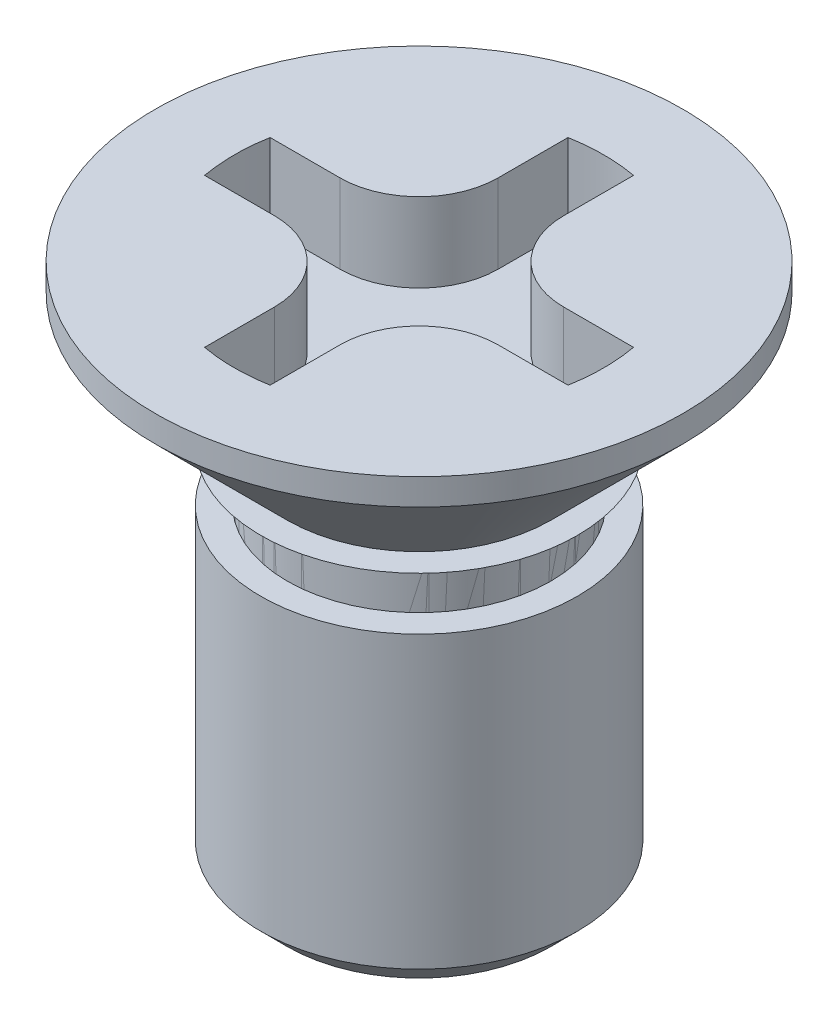
ISO-10303-21;
HEADER;
FILE_DESCRIPTION(('STEP AP214'),'2;1');
FILE_NAME('part.step','',(''),(''),'','','');
FILE_SCHEMA(('AUTOMOTIVE_DESIGN { 1 0 10303 214 1 1 1 1 }'));
ENDSEC;
DATA;
#1=APPLICATION_CONTEXT('core data for automotive mechanical design processes');
#2=APPLICATION_PROTOCOL_DEFINITION('international standard','automotive_design',2000,#1);
#3=PRODUCT_CONTEXT('',#1,'mechanical');
#4=PRODUCT('Part','Part','',(#3));
#5=PRODUCT_RELATED_PRODUCT_CATEGORY('part','',(#4));
#6=PRODUCT_DEFINITION_FORMATION('','',#4);
#7=PRODUCT_DEFINITION_CONTEXT('part definition',#1,'design');
#8=PRODUCT_DEFINITION('design','',#6,#7);
#9=PRODUCT_DEFINITION_SHAPE('','',#8);
#10=(LENGTH_UNIT() NAMED_UNIT(*) SI_UNIT(.MILLI.,.METRE.));
#11=(NAMED_UNIT(*) PLANE_ANGLE_UNIT() SI_UNIT($,.RADIAN.));
#12=(NAMED_UNIT(*) SI_UNIT($,.STERADIAN.) SOLID_ANGLE_UNIT());
#13=UNCERTAINTY_MEASURE_WITH_UNIT(LENGTH_MEASURE(1.E-05),#10,'distance_accuracy_value','');
#14=(GEOMETRIC_REPRESENTATION_CONTEXT(3) GLOBAL_UNCERTAINTY_ASSIGNED_CONTEXT((#13)) GLOBAL_UNIT_ASSIGNED_CONTEXT((#10,
#11,#12)) REPRESENTATION_CONTEXT('',''));
#15=CARTESIAN_POINT('',(0.,0.,0.));
#16=DIRECTION('',(0.,0.,1.));
#17=DIRECTION('',(1.,0.,0.));
#18=AXIS2_PLACEMENT_3D('',#15,#16,#17);
#19=CARTESIAN_POINT('',(0.,0.75,0.));
#20=DIRECTION('',(0.,-1.,0.));
#21=DIRECTION('',(0.,0.,-1.));
#22=AXIS2_PLACEMENT_3D('',#19,#20,#21);
#23=PLANE('',#22);
#24=CARTESIAN_POINT('',(-1.06066017178,0.75,1.06066017178));
#25=DIRECTION('',(0.,1.,0.));
#26=DIRECTION('',(1.,0.,0.));
#27=AXIS2_PLACEMENT_3D('',#24,#25,#26);
#28=CIRCLE('',#27,0.75);
#29=CARTESIAN_POINT('',(-0.3106601717798,0.75,1.06066017178));
#30=VERTEX_POINT('',#29);
#31=CARTESIAN_POINT('',(-1.06066017178,0.75,0.3106601717798));
#32=VERTEX_POINT('',#31);
#33=EDGE_CURVE('P0_E11',#30,#32,#28,.T.);
#34=ORIENTED_EDGE('',*,*,#33,.F.);
#35=DIRECTION('',(0.,0.,-1.));
#36=VECTOR('',#35,1.);
#37=CARTESIAN_POINT('',(-0.3106601717798,0.75,1.722205056801));
#38=LINE('',#37,#36);
#39=CARTESIAN_POINT('',(-0.3106601717798,0.75,1.722205056801));
#40=VERTEX_POINT('',#39);
#41=EDGE_CURVE('P0_E45',#40,#30,#38,.T.);
#42=ORIENTED_EDGE('',*,*,#41,.F.);
#43=CARTESIAN_POINT('',(0.,0.75,0.));
#44=DIRECTION('',(0.,-1.,0.));
#45=DIRECTION('',(0.177520098159893,0.,0.984117175314658));
#46=AXIS2_PLACEMENT_3D('',#43,#44,#45);
#47=CIRCLE('',#46,1.75);
#48=CARTESIAN_POINT('',(0.3106601717798,0.75,1.722205056801));
#49=VERTEX_POINT('',#48);
#50=EDGE_CURVE('P0_E184',#49,#40,#47,.T.);
#51=ORIENTED_EDGE('',*,*,#50,.F.);
#52=DIRECTION('',(0.,0.,1.));
#53=VECTOR('',#52,1.);
#54=CARTESIAN_POINT('',(0.3106601717798,0.75,1.06066017178));
#55=LINE('',#54,#53);
#56=CARTESIAN_POINT('',(0.3106601717798,0.75,1.06066017178));
#57=VERTEX_POINT('',#56);
#58=EDGE_CURVE('P0_E107',#57,#49,#55,.T.);
#59=ORIENTED_EDGE('',*,*,#58,.F.);
#60=CARTESIAN_POINT('',(1.06066017178,0.75,1.06066017178));
#61=DIRECTION('',(0.,1.,0.));
#62=DIRECTION('',(0.,0.,-1.));
#63=AXIS2_PLACEMENT_3D('',#60,#61,#62);
#64=CIRCLE('',#63,0.75);
#65=CARTESIAN_POINT('',(1.06066017178,0.75,0.3106601717798));
#66=VERTEX_POINT('',#65);
#67=EDGE_CURVE('P0_E99',#66,#57,#64,.T.);
#68=ORIENTED_EDGE('',*,*,#67,.F.);
#69=DIRECTION('',(-1.,0.,0.));
#70=VECTOR('',#69,1.);
#71=CARTESIAN_POINT('',(1.722205056801,0.75,0.3106601717798));
#72=LINE('',#71,#70);
#73=CARTESIAN_POINT('',(1.722205056801,0.75,0.3106601717798));
#74=VERTEX_POINT('',#73);
#75=EDGE_CURVE('P0_E238',#74,#66,#72,.T.);
#76=ORIENTED_EDGE('',*,*,#75,.F.);
#77=CARTESIAN_POINT('',(0.,0.75,0.));
#78=DIRECTION('',(0.,-1.,0.));
#79=DIRECTION('',(0.984117175314658,0.,-0.177520098159893));
#80=AXIS2_PLACEMENT_3D('',#77,#78,#79);
#81=CIRCLE('',#80,1.75);
#82=CARTESIAN_POINT('',(1.722205056801,0.75,-0.3106601717798));
#83=VERTEX_POINT('',#82);
#84=EDGE_CURVE('P0_E239',#83,#74,#81,.T.);
#85=ORIENTED_EDGE('',*,*,#84,.F.);
#86=DIRECTION('',(1.,0.,0.));
#87=VECTOR('',#86,1.);
#88=CARTESIAN_POINT('',(1.06066017178,0.75,-0.3106601717798));
#89=LINE('',#88,#87);
#90=CARTESIAN_POINT('',(1.06066017178,0.75,-0.3106601717798));
#91=VERTEX_POINT('',#90);
#92=EDGE_CURVE('P0_E243',#91,#83,#89,.T.);
#93=ORIENTED_EDGE('',*,*,#92,.F.);
#94=CARTESIAN_POINT('',(1.06066017178,0.75,-1.06066017178));
#95=DIRECTION('',(0.,1.,0.));
#96=DIRECTION('',(-1.,0.,0.));
#97=AXIS2_PLACEMENT_3D('',#94,#95,#96);
#98=CIRCLE('',#97,0.75);
#99=CARTESIAN_POINT('',(0.3106601717798,0.75,-1.06066017178));
#100=VERTEX_POINT('',#99);
#101=EDGE_CURVE('P0_E244',#100,#91,#98,.T.);
#102=ORIENTED_EDGE('',*,*,#101,.F.);
#103=DIRECTION('',(0.,0.,1.));
#104=VECTOR('',#103,1.);
#105=CARTESIAN_POINT('',(0.3106601717798,0.75,-1.722205056801));
#106=LINE('',#105,#104);
#107=CARTESIAN_POINT('',(0.3106601717798,0.75,-1.722205056801));
#108=VERTEX_POINT('',#107);
#109=EDGE_CURVE('P0_E255',#108,#100,#106,.T.);
#110=ORIENTED_EDGE('',*,*,#109,.F.);
#111=CARTESIAN_POINT('',(0.,0.75,0.));
#112=DIRECTION('',(0.,-1.,0.));
#113=DIRECTION('',(-0.177520098159893,0.,-0.984117175314658));
#114=AXIS2_PLACEMENT_3D('',#111,#112,#113);
#115=CIRCLE('',#114,1.75);
#116=CARTESIAN_POINT('',(-0.3106601717798,0.75,-1.722205056801));
#117=VERTEX_POINT('',#116);
#118=EDGE_CURVE('P0_E256',#117,#108,#115,.T.);
#119=ORIENTED_EDGE('',*,*,#118,.F.);
#120=DIRECTION('',(0.,0.,-1.));
#121=VECTOR('',#120,1.);
#122=CARTESIAN_POINT('',(-0.3106601717798,0.75,-1.06066017178));
#123=LINE('',#122,#121);
#124=CARTESIAN_POINT('',(-0.3106601717798,0.75,-1.06066017178));
#125=VERTEX_POINT('',#124);
#126=EDGE_CURVE('P0_E251',#125,#117,#123,.T.);
#127=ORIENTED_EDGE('',*,*,#126,.F.);
#128=CARTESIAN_POINT('',(-1.06066017178,0.75,-1.06066017178));
#129=DIRECTION('',(0.,1.,0.));
#130=DIRECTION('',(0.,0.,1.));
#131=AXIS2_PLACEMENT_3D('',#128,#129,#130);
#132=CIRCLE('',#131,0.75);
#133=CARTESIAN_POINT('',(-1.06066017178,0.75,-0.3106601717798));
#134=VERTEX_POINT('',#133);
#135=EDGE_CURVE('P0_E234',#134,#125,#132,.T.);
#136=ORIENTED_EDGE('',*,*,#135,.F.);
#137=DIRECTION('',(1.,0.,0.));
#138=VECTOR('',#137,1.);
#139=CARTESIAN_POINT('',(-1.722205056801,0.75,-0.3106601717798));
#140=LINE('',#139,#138);
#141=CARTESIAN_POINT('',(-1.722205056801,0.75,-0.3106601717798));
#142=VERTEX_POINT('',#141);
#143=EDGE_CURVE('P0_E227',#142,#134,#140,.T.);
#144=ORIENTED_EDGE('',*,*,#143,.F.);
#145=CARTESIAN_POINT('',(0.,0.75,0.));
#146=DIRECTION('',(0.,-1.,0.));
#147=DIRECTION('',(-0.984117175314658,0.,0.177520098159893));
#148=AXIS2_PLACEMENT_3D('',#145,#146,#147);
#149=CIRCLE('',#148,1.75);
#150=CARTESIAN_POINT('',(-1.722205056801,0.75,0.3106601717798));
#151=VERTEX_POINT('',#150);
#152=EDGE_CURVE('P0_E219',#151,#142,#149,.T.);
#153=ORIENTED_EDGE('',*,*,#152,.F.);
#154=DIRECTION('',(-1.,0.,0.));
#155=VECTOR('',#154,1.);
#156=CARTESIAN_POINT('',(-1.06066017178,0.75,0.3106601717798));
#157=LINE('',#156,#155);
#158=EDGE_CURVE('P0_E218',#32,#151,#157,.T.);
#159=ORIENTED_EDGE('',*,*,#158,.F.);
#160=EDGE_LOOP('',(#34,#42,#51,#59,#68,#76,#85,#93,#102,#110,#119,#127,#136,#144,#153,#159));
#161=FACE_BOUND('',#160,.T.);
#162=ADVANCED_FACE('P0_F17',(#161),#23,.F.);
#163=CARTESIAN_POINT('',(-1.06066017178,0.75,1.06066017178));
#164=DIRECTION('',(0.,-1.,0.));
#165=DIRECTION('',(1.,0.,0.));
#166=AXIS2_PLACEMENT_3D('',#163,#164,#165);
#167=CYLINDRICAL_SURFACE('',#166,0.75);
#168=DIRECTION('',(0.,1.,0.));
#169=VECTOR('',#168,1.);
#170=CARTESIAN_POINT('',(-0.3106601717798,0.75,1.06066017178));
#171=LINE('',#170,#169);
#172=CARTESIAN_POINT('',(-0.3106601717798,1.5,1.06066017178));
#173=VERTEX_POINT('',#172);
#174=EDGE_CURVE('P0_E25',#30,#173,#171,.T.);
#175=ORIENTED_EDGE('',*,*,#174,.F.);
#176=ORIENTED_EDGE('',*,*,#33,.T.);
#177=DIRECTION('',(0.,1.,0.));
#178=VECTOR('',#177,1.);
#179=CARTESIAN_POINT('',(-1.06066017178,0.75,0.3106601717798));
#180=LINE('',#179,#178);
#181=CARTESIAN_POINT('',(-1.06066017178,1.5,0.3106601717798));
#182=VERTEX_POINT('',#181);
#183=EDGE_CURVE('P0_E215',#32,#182,#180,.T.);
#184=ORIENTED_EDGE('',*,*,#183,.T.);
#185=CARTESIAN_POINT('',(-1.06066017178,1.5,1.06066017178));
#186=DIRECTION('',(0.,1.,0.));
#187=DIRECTION('',(1.,0.,0.));
#188=AXIS2_PLACEMENT_3D('',#185,#186,#187);
#189=CIRCLE('',#188,0.75);
#190=EDGE_CURVE('P0_E195',#173,#182,#189,.T.);
#191=ORIENTED_EDGE('',*,*,#190,.F.);
#192=EDGE_LOOP('',(#175,#176,#184,#191));
#193=FACE_BOUND('',#192,.T.);
#194=ADVANCED_FACE('P0_F396',(#193),#167,.T.);
#195=CARTESIAN_POINT('',(-0.3106601717798,0.75,1.722205056801));
#196=DIRECTION('',(-1.,0.,0.));
#197=DIRECTION('',(0.,0.,1.));
#198=AXIS2_PLACEMENT_3D('',#195,#196,#197);
#199=PLANE('',#198);
#200=DIRECTION('',(0.,1.,0.));
#201=VECTOR('',#200,1.);
#202=CARTESIAN_POINT('',(-0.3106601717798,0.75,1.722205056801));
#203=LINE('',#202,#201);
#204=CARTESIAN_POINT('',(-0.3106601717798,1.5,1.722205056801));
#205=VERTEX_POINT('',#204);
#206=EDGE_CURVE('P0_E178',#40,#205,#203,.T.);
#207=ORIENTED_EDGE('',*,*,#206,.F.);
#208=ORIENTED_EDGE('',*,*,#41,.T.);
#209=ORIENTED_EDGE('',*,*,#174,.T.);
#210=DIRECTION('',(0.,0.,-1.));
#211=VECTOR('',#210,1.);
#212=CARTESIAN_POINT('',(-0.3106601717798,1.5,1.722205056801));
#213=LINE('',#212,#211);
#214=EDGE_CURVE('P0_E189',#205,#173,#213,.T.);
#215=ORIENTED_EDGE('',*,*,#214,.F.);
#216=EDGE_LOOP('',(#207,#208,#209,#215));
#217=FACE_BOUND('',#216,.T.);
#218=ADVANCED_FACE('P0_F190',(#217),#199,.F.);
#219=CARTESIAN_POINT('',(0.,0.75,0.));
#220=DIRECTION('',(0.,-1.,0.));
#221=DIRECTION('',(1.,0.,0.));
#222=AXIS2_PLACEMENT_3D('',#219,#220,#221);
#223=CYLINDRICAL_SURFACE('',#222,1.75);
#224=DIRECTION('',(0.,1.,0.));
#225=VECTOR('',#224,1.);
#226=CARTESIAN_POINT('',(0.3106601717798,0.75,1.722205056801));
#227=LINE('',#226,#225);
#228=CARTESIAN_POINT('',(0.3106601717798,1.5,1.722205056801));
#229=VERTEX_POINT('',#228);
#230=EDGE_CURVE('P0_E172',#49,#229,#227,.T.);
#231=ORIENTED_EDGE('',*,*,#230,.F.);
#232=ORIENTED_EDGE('',*,*,#50,.T.);
#233=ORIENTED_EDGE('',*,*,#206,.T.);
#234=CARTESIAN_POINT('',(0.,1.5,0.));
#235=DIRECTION('',(0.,-1.,0.));
#236=DIRECTION('',(0.177520098159893,0.,0.984117175314658));
#237=AXIS2_PLACEMENT_3D('',#234,#235,#236);
#238=CIRCLE('',#237,1.75);
#239=EDGE_CURVE('P0_E182',#229,#205,#238,.T.);
#240=ORIENTED_EDGE('',*,*,#239,.F.);
#241=EDGE_LOOP('',(#231,#232,#233,#240));
#242=FACE_BOUND('',#241,.T.);
#243=ADVANCED_FACE('P0_F180',(#242),#223,.F.);
#244=CARTESIAN_POINT('',(0.3106601717798,0.75,1.06066017178));
#245=DIRECTION('',(1.,0.,0.));
#246=DIRECTION('',(0.,1.,0.));
#247=AXIS2_PLACEMENT_3D('',#244,#245,#246);
#248=PLANE('',#247);
#249=DIRECTION('',(0.,1.,0.));
#250=VECTOR('',#249,1.);
#251=CARTESIAN_POINT('',(0.3106601717798,0.75,1.06066017178));
#252=LINE('',#251,#250);
#253=CARTESIAN_POINT('',(0.3106601717798,1.5,1.06066017178));
#254=VERTEX_POINT('',#253);
#255=EDGE_CURVE('P0_E274',#57,#254,#252,.T.);
#256=ORIENTED_EDGE('',*,*,#255,.F.);
#257=ORIENTED_EDGE('',*,*,#58,.T.);
#258=ORIENTED_EDGE('',*,*,#230,.T.);
#259=DIRECTION('',(0.,0.,1.));
#260=VECTOR('',#259,1.);
#261=CARTESIAN_POINT('',(0.3106601717798,1.5,1.06066017178));
#262=LINE('',#261,#260);
#263=EDGE_CURVE('P0_E201',#254,#229,#262,.T.);
#264=ORIENTED_EDGE('',*,*,#263,.F.);
#265=EDGE_LOOP('',(#256,#257,#258,#264));
#266=FACE_BOUND('',#265,.T.);
#267=ADVANCED_FACE('P0_F384',(#266),#248,.F.);
#268=CARTESIAN_POINT('',(1.06066017178,0.75,1.06066017178));
#269=DIRECTION('',(0.,-1.,0.));
#270=DIRECTION('',(1.,0.,0.));
#271=AXIS2_PLACEMENT_3D('',#268,#269,#270);
#272=CYLINDRICAL_SURFACE('',#271,0.75);
#273=DIRECTION('',(0.,1.,0.));
#274=VECTOR('',#273,1.);
#275=CARTESIAN_POINT('',(1.06066017178,0.75,0.3106601717798));
#276=LINE('',#275,#274);
#277=CARTESIAN_POINT('',(1.06066017178,1.5,0.3106601717798));
#278=VERTEX_POINT('',#277);
#279=EDGE_CURVE('P0_E269',#66,#278,#276,.T.);
#280=ORIENTED_EDGE('',*,*,#279,.F.);
#281=ORIENTED_EDGE('',*,*,#67,.T.);
#282=ORIENTED_EDGE('',*,*,#255,.T.);
#283=CARTESIAN_POINT('',(1.06066017178,1.5,1.06066017178));
#284=DIRECTION('',(0.,1.,0.));
#285=DIRECTION('',(0.,0.,-1.));
#286=AXIS2_PLACEMENT_3D('',#283,#284,#285);
#287=CIRCLE('',#286,0.75);
#288=EDGE_CURVE('P0_E207',#278,#254,#287,.T.);
#289=ORIENTED_EDGE('',*,*,#288,.F.);
#290=EDGE_LOOP('',(#280,#281,#282,#289));
#291=FACE_BOUND('',#290,.T.);
#292=ADVANCED_FACE('P0_F383',(#291),#272,.T.);
#293=CARTESIAN_POINT('',(1.722205056801,0.75,0.3106601717798));
#294=DIRECTION('',(0.,0.,1.));
#295=DIRECTION('',(1.,0.,0.));
#296=AXIS2_PLACEMENT_3D('',#293,#294,#295);
#297=PLANE('',#296);
#298=DIRECTION('',(0.,1.,0.));
#299=VECTOR('',#298,1.);
#300=CARTESIAN_POINT('',(1.722205056801,0.75,0.3106601717798));
#301=LINE('',#300,#299);
#302=CARTESIAN_POINT('',(1.722205056801,1.5,0.3106601717798));
#303=VERTEX_POINT('',#302);
#304=EDGE_CURVE('P0_E235',#74,#303,#301,.T.);
#305=ORIENTED_EDGE('',*,*,#304,.F.);
#306=ORIENTED_EDGE('',*,*,#75,.T.);
#307=ORIENTED_EDGE('',*,*,#279,.T.);
#308=DIRECTION('',(-1.,0.,0.));
#309=VECTOR('',#308,1.);
#310=CARTESIAN_POINT('',(1.722205056801,1.5,0.3106601717798));
#311=LINE('',#310,#309);
#312=EDGE_CURVE('P0_E335',#303,#278,#311,.T.);
#313=ORIENTED_EDGE('',*,*,#312,.F.);
#314=EDGE_LOOP('',(#305,#306,#307,#313));
#315=FACE_BOUND('',#314,.T.);
#316=ADVANCED_FACE('P0_F392',(#315),#297,.F.);
#317=CARTESIAN_POINT('',(0.,0.75,0.));
#318=DIRECTION('',(0.,-1.,0.));
#319=DIRECTION('',(1.,0.,0.));
#320=AXIS2_PLACEMENT_3D('',#317,#318,#319);
#321=CYLINDRICAL_SURFACE('',#320,1.75);
#322=DIRECTION('',(0.,1.,0.));
#323=VECTOR('',#322,1.);
#324=CARTESIAN_POINT('',(1.722205056801,0.75,-0.3106601717798));
#325=LINE('',#324,#323);
#326=CARTESIAN_POINT('',(1.722205056801,1.5,-0.3106601717798));
#327=VERTEX_POINT('',#326);
#328=EDGE_CURVE('P0_E263',#83,#327,#325,.T.);
#329=ORIENTED_EDGE('',*,*,#328,.F.);
#330=ORIENTED_EDGE('',*,*,#84,.T.);
#331=ORIENTED_EDGE('',*,*,#304,.T.);
#332=CARTESIAN_POINT('',(0.,1.5,0.));
#333=DIRECTION('',(0.,-1.,0.));
#334=DIRECTION('',(0.984117175314658,0.,-0.177520098159893));
#335=AXIS2_PLACEMENT_3D('',#332,#333,#334);
#336=CIRCLE('',#335,1.75);
#337=EDGE_CURVE('P0_E339',#327,#303,#336,.T.);
#338=ORIENTED_EDGE('',*,*,#337,.F.);
#339=EDGE_LOOP('',(#329,#330,#331,#338));
#340=FACE_BOUND('',#339,.T.);
#341=ADVANCED_FACE('P0_F447',(#340),#321,.F.);
#342=CARTESIAN_POINT('',(1.06066017178,0.75,-0.3106601717798));
#343=DIRECTION('',(0.,0.,-1.));
#344=DIRECTION('',(0.,-1.,0.));
#345=AXIS2_PLACEMENT_3D('',#342,#343,#344);
#346=PLANE('',#345);
#347=ORIENTED_EDGE('',*,*,#92,.T.);
#348=ORIENTED_EDGE('',*,*,#328,.T.);
#349=DIRECTION('',(1.,0.,0.));
#350=VECTOR('',#349,1.);
#351=CARTESIAN_POINT('',(1.06066017178,1.5,-0.3106601717798));
#352=LINE('',#351,#350);
#353=CARTESIAN_POINT('',(1.06066017178,1.5,-0.3106601717798));
#354=VERTEX_POINT('',#353);
#355=EDGE_CURVE('P0_E368',#354,#327,#352,.T.);
#356=ORIENTED_EDGE('',*,*,#355,.F.);
#357=DIRECTION('',(0.,1.,0.));
#358=VECTOR('',#357,1.);
#359=CARTESIAN_POINT('',(1.06066017178,0.75,-0.3106601717798));
#360=LINE('',#359,#358);
#361=EDGE_CURVE('P0_E240',#91,#354,#360,.T.);
#362=ORIENTED_EDGE('',*,*,#361,.F.);
#363=EDGE_LOOP('',(#347,#348,#356,#362));
#364=FACE_BOUND('',#363,.T.);
#365=ADVANCED_FACE('P0_F443',(#364),#346,.F.);
#366=CARTESIAN_POINT('',(1.06066017178,0.75,-1.06066017178));
#367=DIRECTION('',(0.,-1.,0.));
#368=DIRECTION('',(1.,0.,0.));
#369=AXIS2_PLACEMENT_3D('',#366,#367,#368);
#370=CYLINDRICAL_SURFACE('',#369,0.75);
#371=ORIENTED_EDGE('',*,*,#101,.T.);
#372=ORIENTED_EDGE('',*,*,#361,.T.);
#373=CARTESIAN_POINT('',(1.06066017178,1.5,-1.06066017178));
#374=DIRECTION('',(0.,-1.,0.));
#375=DIRECTION('',(0.,0.,1.));
#376=AXIS2_PLACEMENT_3D('',#373,#374,#375);
#377=CIRCLE('',#376,0.75);
#378=CARTESIAN_POINT('',(0.3106601717798,1.5,-1.06066017178));
#379=VERTEX_POINT('',#378);
#380=EDGE_CURVE('P0_E362',#354,#379,#377,.T.);
#381=ORIENTED_EDGE('',*,*,#380,.T.);
#382=DIRECTION('',(0.,1.,0.));
#383=VECTOR('',#382,1.);
#384=CARTESIAN_POINT('',(0.3106601717798,0.75,-1.06066017178));
#385=LINE('',#384,#383);
#386=EDGE_CURVE('P0_E257',#100,#379,#385,.T.);
#387=ORIENTED_EDGE('',*,*,#386,.F.);
#388=EDGE_LOOP('',(#371,#372,#381,#387));
#389=FACE_BOUND('',#388,.T.);
#390=ADVANCED_FACE('P0_F439',(#389),#370,.T.);
#391=CARTESIAN_POINT('',(0.3106601717798,0.75,-1.722205056801));
#392=DIRECTION('',(1.,0.,0.));
#393=DIRECTION('',(0.,1.,0.));
#394=AXIS2_PLACEMENT_3D('',#391,#392,#393);
#395=PLANE('',#394);
#396=ORIENTED_EDGE('',*,*,#109,.T.);
#397=ORIENTED_EDGE('',*,*,#386,.T.);
#398=DIRECTION('',(0.,0.,1.));
#399=VECTOR('',#398,1.);
#400=CARTESIAN_POINT('',(0.3106601717798,1.5,-1.722205056801));
#401=LINE('',#400,#399);
#402=CARTESIAN_POINT('',(0.3106601717798,1.5,-1.722205056801));
#403=VERTEX_POINT('',#402);
#404=EDGE_CURVE('P0_E355',#403,#379,#401,.T.);
#405=ORIENTED_EDGE('',*,*,#404,.F.);
#406=DIRECTION('',(0.,1.,0.));
#407=VECTOR('',#406,1.);
#408=CARTESIAN_POINT('',(0.3106601717798,0.75,-1.722205056801));
#409=LINE('',#408,#407);
#410=EDGE_CURVE('P0_E252',#108,#403,#409,.T.);
#411=ORIENTED_EDGE('',*,*,#410,.F.);
#412=EDGE_LOOP('',(#396,#397,#405,#411));
#413=FACE_BOUND('',#412,.T.);
#414=ADVANCED_FACE('P0_F436',(#413),#395,.F.);
#415=CARTESIAN_POINT('',(0.,0.75,0.));
#416=DIRECTION('',(0.,-1.,0.));
#417=DIRECTION('',(1.,0.,0.));
#418=AXIS2_PLACEMENT_3D('',#415,#416,#417);
#419=CYLINDRICAL_SURFACE('',#418,1.75);
#420=ORIENTED_EDGE('',*,*,#118,.T.);
#421=ORIENTED_EDGE('',*,*,#410,.T.);
#422=CARTESIAN_POINT('',(0.,1.5,0.));
#423=DIRECTION('',(0.,-1.,0.));
#424=DIRECTION('',(-0.177520098159893,0.,-0.984117175314658));
#425=AXIS2_PLACEMENT_3D('',#422,#423,#424);
#426=CIRCLE('',#425,1.75);
#427=CARTESIAN_POINT('',(-0.3106601717798,1.5,-1.722205056801));
#428=VERTEX_POINT('',#427);
#429=EDGE_CURVE('P0_E351',#428,#403,#426,.T.);
#430=ORIENTED_EDGE('',*,*,#429,.F.);
#431=DIRECTION('',(0.,1.,0.));
#432=VECTOR('',#431,1.);
#433=CARTESIAN_POINT('',(-0.3106601717798,0.75,-1.722205056801));
#434=LINE('',#433,#432);
#435=EDGE_CURVE('P0_E284',#117,#428,#434,.T.);
#436=ORIENTED_EDGE('',*,*,#435,.F.);
#437=EDGE_LOOP('',(#420,#421,#430,#436));
#438=FACE_BOUND('',#437,.T.);
#439=ADVANCED_FACE('P0_F431',(#438),#419,.F.);
#440=CARTESIAN_POINT('',(-0.3106601717798,0.75,-1.06066017178));
#441=DIRECTION('',(-1.,0.,0.));
#442=DIRECTION('',(0.,0.,1.));
#443=AXIS2_PLACEMENT_3D('',#440,#441,#442);
#444=PLANE('',#443);
#445=ORIENTED_EDGE('',*,*,#126,.T.);
#446=ORIENTED_EDGE('',*,*,#435,.T.);
#447=DIRECTION('',(0.,0.,-1.));
#448=VECTOR('',#447,1.);
#449=CARTESIAN_POINT('',(-0.3106601717798,1.5,-1.06066017178));
#450=LINE('',#449,#448);
#451=CARTESIAN_POINT('',(-0.3106601717798,1.5,-1.06066017178));
#452=VERTEX_POINT('',#451);
#453=EDGE_CURVE('P0_E347',#452,#428,#450,.T.);
#454=ORIENTED_EDGE('',*,*,#453,.F.);
#455=DIRECTION('',(0.,1.,0.));
#456=VECTOR('',#455,1.);
#457=CARTESIAN_POINT('',(-0.3106601717798,0.75,-1.06066017178));
#458=LINE('',#457,#456);
#459=EDGE_CURVE('P0_E248',#125,#452,#458,.T.);
#460=ORIENTED_EDGE('',*,*,#459,.F.);
#461=EDGE_LOOP('',(#445,#446,#454,#460));
#462=FACE_BOUND('',#461,.T.);
#463=ADVANCED_FACE('P0_F427',(#462),#444,.F.);
#464=CARTESIAN_POINT('',(-1.06066017178,0.75,-1.06066017178));
#465=DIRECTION('',(0.,-1.,0.));
#466=DIRECTION('',(1.,0.,0.));
#467=AXIS2_PLACEMENT_3D('',#464,#465,#466);
#468=CYLINDRICAL_SURFACE('',#467,0.75);
#469=ORIENTED_EDGE('',*,*,#135,.T.);
#470=ORIENTED_EDGE('',*,*,#459,.T.);
#471=CARTESIAN_POINT('',(-1.06066017178,1.5,-1.06066017178));
#472=DIRECTION('',(0.,-1.,0.));
#473=DIRECTION('',(1.,0.,0.));
#474=AXIS2_PLACEMENT_3D('',#471,#472,#473);
#475=CIRCLE('',#474,0.75);
#476=CARTESIAN_POINT('',(-1.06066017178,1.5,-0.3106601717798));
#477=VERTEX_POINT('',#476);
#478=EDGE_CURVE('P0_E343',#452,#477,#475,.T.);
#479=ORIENTED_EDGE('',*,*,#478,.T.);
#480=DIRECTION('',(0.,1.,0.));
#481=VECTOR('',#480,1.);
#482=CARTESIAN_POINT('',(-1.06066017178,0.75,-0.3106601717798));
#483=LINE('',#482,#481);
#484=EDGE_CURVE('P0_E231',#134,#477,#483,.T.);
#485=ORIENTED_EDGE('',*,*,#484,.F.);
#486=EDGE_LOOP('',(#469,#470,#479,#485));
#487=FACE_BOUND('',#486,.T.);
#488=ADVANCED_FACE('P0_F424',(#487),#468,.T.);
#489=CARTESIAN_POINT('',(-1.722205056801,0.75,-0.3106601717798));
#490=DIRECTION('',(0.,0.,-1.));
#491=DIRECTION('',(0.,-1.,0.));
#492=AXIS2_PLACEMENT_3D('',#489,#490,#491);
#493=PLANE('',#492);
#494=ORIENTED_EDGE('',*,*,#143,.T.);
#495=ORIENTED_EDGE('',*,*,#484,.T.);
#496=DIRECTION('',(1.,0.,0.));
#497=VECTOR('',#496,1.);
#498=CARTESIAN_POINT('',(-1.722205056801,1.5,-0.3106601717798));
#499=LINE('',#498,#497);
#500=CARTESIAN_POINT('',(-1.722205056801,1.5,-0.3106601717798));
#501=VERTEX_POINT('',#500);
#502=EDGE_CURVE('P0_E325',#501,#477,#499,.T.);
#503=ORIENTED_EDGE('',*,*,#502,.F.);
#504=DIRECTION('',(0.,1.,0.));
#505=VECTOR('',#504,1.);
#506=CARTESIAN_POINT('',(-1.722205056801,0.75,-0.3106601717798));
#507=LINE('',#506,#505);
#508=EDGE_CURVE('P0_E223',#142,#501,#507,.T.);
#509=ORIENTED_EDGE('',*,*,#508,.F.);
#510=EDGE_LOOP('',(#494,#495,#503,#509));
#511=FACE_BOUND('',#510,.T.);
#512=ADVANCED_FACE('P0_F419',(#511),#493,.F.);
#513=CARTESIAN_POINT('',(0.,0.75,0.));
#514=DIRECTION('',(0.,-1.,0.));
#515=DIRECTION('',(1.,0.,0.));
#516=AXIS2_PLACEMENT_3D('',#513,#514,#515);
#517=CYLINDRICAL_SURFACE('',#516,1.75);
#518=DIRECTION('',(0.,1.,0.));
#519=VECTOR('',#518,1.);
#520=CARTESIAN_POINT('',(-1.722205056801,0.75,0.3106601717798));
#521=LINE('',#520,#519);
#522=CARTESIAN_POINT('',(-1.722205056801,1.5,0.3106601717798));
#523=VERTEX_POINT('',#522);
#524=EDGE_CURVE('P0_E224',#151,#523,#521,.T.);
#525=ORIENTED_EDGE('',*,*,#524,.F.);
#526=ORIENTED_EDGE('',*,*,#152,.T.);
#527=ORIENTED_EDGE('',*,*,#508,.T.);
#528=CARTESIAN_POINT('',(0.,1.5,0.));
#529=DIRECTION('',(0.,-1.,0.));
#530=DIRECTION('',(-0.984117175314658,0.,0.177520098159893));
#531=AXIS2_PLACEMENT_3D('',#528,#529,#530);
#532=CIRCLE('',#531,1.75);
#533=EDGE_CURVE('P0_E322',#523,#501,#532,.T.);
#534=ORIENTED_EDGE('',*,*,#533,.F.);
#535=EDGE_LOOP('',(#525,#526,#527,#534));
#536=FACE_BOUND('',#535,.T.);
#537=ADVANCED_FACE('P0_F415',(#536),#517,.F.);
#538=CARTESIAN_POINT('',(-1.06066017178,0.75,0.3106601717798));
#539=DIRECTION('',(0.,0.,1.));
#540=DIRECTION('',(1.,0.,0.));
#541=AXIS2_PLACEMENT_3D('',#538,#539,#540);
#542=PLANE('',#541);
#543=ORIENTED_EDGE('',*,*,#183,.F.);
#544=ORIENTED_EDGE('',*,*,#158,.T.);
#545=ORIENTED_EDGE('',*,*,#524,.T.);
#546=DIRECTION('',(-1.,0.,0.));
#547=VECTOR('',#546,1.);
#548=CARTESIAN_POINT('',(-1.06066017178,1.5,0.3106601717798));
#549=LINE('',#548,#547);
#550=EDGE_CURVE('P0_E211',#182,#523,#549,.T.);
#551=ORIENTED_EDGE('',*,*,#550,.F.);
#552=EDGE_LOOP('',(#543,#544,#545,#551));
#553=FACE_BOUND('',#552,.T.);
#554=ADVANCED_FACE('P0_F450',(#553),#542,.F.);
#555=CARTESIAN_POINT('',(0.,1.5,0.));
#556=DIRECTION('',(0.,-1.,0.));
#557=DIRECTION('',(0.,0.,-1.));
#558=AXIS2_PLACEMENT_3D('',#555,#556,#557);
#559=PLANE('',#558);
#560=ORIENTED_EDGE('',*,*,#533,.T.);
#561=ORIENTED_EDGE('',*,*,#502,.T.);
#562=ORIENTED_EDGE('',*,*,#478,.F.);
#563=ORIENTED_EDGE('',*,*,#453,.T.);
#564=ORIENTED_EDGE('',*,*,#429,.T.);
#565=ORIENTED_EDGE('',*,*,#404,.T.);
#566=ORIENTED_EDGE('',*,*,#380,.F.);
#567=ORIENTED_EDGE('',*,*,#355,.T.);
#568=ORIENTED_EDGE('',*,*,#337,.T.);
#569=ORIENTED_EDGE('',*,*,#312,.T.);
#570=ORIENTED_EDGE('',*,*,#288,.T.);
#571=ORIENTED_EDGE('',*,*,#263,.T.);
#572=ORIENTED_EDGE('',*,*,#239,.T.);
#573=ORIENTED_EDGE('',*,*,#214,.T.);
#574=ORIENTED_EDGE('',*,*,#190,.T.);
#575=ORIENTED_EDGE('',*,*,#550,.T.);
#576=EDGE_LOOP('',(#560,#561,#562,#563,#564,#565,#566,#567,#568,#569,#570,#571,#572,#573,#574,#575));
#577=FACE_BOUND('',#576,.T.);
#578=CARTESIAN_POINT('',(0.,1.5,0.));
#579=DIRECTION('',(0.,-1.,0.));
#580=DIRECTION('',(1.,0.,0.));
#581=AXIS2_PLACEMENT_3D('',#578,#579,#580);
#582=CIRCLE('',#581,2.5);
#583=CARTESIAN_POINT('',(2.5,1.5,0.));
#584=VERTEX_POINT('',#583);
#585=EDGE_CURVE('P0_E326',#584,#584,#582,.T.);
#586=ORIENTED_EDGE('',*,*,#585,.F.);
#587=EDGE_LOOP('',(#586));
#588=FACE_BOUND('',#587,.T.);
#589=ADVANCED_FACE('P0_F198',(#577,#588),#559,.F.);
#590=CARTESIAN_POINT('',(0.,1.75,0.));
#591=DIRECTION('',(0.,-1.,0.));
#592=DIRECTION('',(-1.,0.,0.));
#593=AXIS2_PLACEMENT_3D('',#590,#591,#592);
#594=CYLINDRICAL_SURFACE('',#593,2.5);
#595=ORIENTED_EDGE('',*,*,#585,.T.);
#596=EDGE_LOOP('',(#595));
#597=FACE_BOUND('',#596,.T.);
#598=CARTESIAN_POINT('',(0.,1.25,0.));
#599=DIRECTION('',(0.,-1.,0.));
#600=DIRECTION('',(1.,0.,0.));
#601=AXIS2_PLACEMENT_3D('',#598,#599,#600);
#602=CIRCLE('',#601,2.5);
#603=CARTESIAN_POINT('',(2.5,1.25,0.));
#604=VERTEX_POINT('',#603);
#605=EDGE_CURVE('P0_E316',#604,#604,#602,.T.);
#606=ORIENTED_EDGE('',*,*,#605,.F.);
#607=EDGE_LOOP('',(#606));
#608=FACE_BOUND('',#607,.T.);
#609=ADVANCED_FACE('P0_F457',(#597,#608),#594,.T.);
#610=CARTESIAN_POINT('',(0.,0.625,0.));
#611=DIRECTION('',(0.,1.,0.));
#612=DIRECTION('',(1.,0.,0.));
#613=AXIS2_PLACEMENT_3D('',#610,#611,#612);
#614=CONICAL_SURFACE('',#613,1.875,0.7853981633973);
#615=CARTESIAN_POINT('',(0.,0.,0.));
#616=DIRECTION('',(0.,1.,0.));
#617=DIRECTION('',(1.,0.,0.));
#618=AXIS2_PLACEMENT_3D('',#615,#616,#617);
#619=CIRCLE('',#618,1.25);
#620=CARTESIAN_POINT('',(1.25,0.,0.));
#621=VERTEX_POINT('',#620);
#622=EDGE_CURVE('P0_E303',#621,#621,#619,.T.);
#623=ORIENTED_EDGE('',*,*,#622,.T.);
#624=EDGE_LOOP('',(#623));
#625=FACE_BOUND('',#624,.T.);
#626=ORIENTED_EDGE('',*,*,#605,.T.);
#627=EDGE_LOOP('',(#626));
#628=FACE_BOUND('',#627,.T.);
#629=ADVANCED_FACE('P0_F470',(#625,#628),#614,.T.);
#630=CARTESIAN_POINT('',(0.,-0.6,0.));
#631=DIRECTION('',(0.,1.,0.));
#632=DIRECTION('',(1.,0.,0.));
#633=AXIS2_PLACEMENT_3D('',#630,#631,#632);
#634=CYLINDRICAL_SURFACE('',#633,1.25);
#635=CARTESIAN_POINT('',(0.,-0.5,0.));
#636=DIRECTION('',(0.,-1.,0.));
#637=DIRECTION('',(1.,0.,0.));
#638=AXIS2_PLACEMENT_3D('',#635,#636,#637);
#639=CIRCLE('',#638,1.25);
#640=CARTESIAN_POINT('',(1.25,-0.5,0.));
#641=VERTEX_POINT('',#640);
#642=EDGE_CURVE('P0_E299',#641,#641,#639,.T.);
#643=ORIENTED_EDGE('',*,*,#642,.F.);
#644=EDGE_LOOP('',(#643));
#645=FACE_BOUND('',#644,.T.);
#646=ORIENTED_EDGE('',*,*,#622,.F.);
#647=EDGE_LOOP('',(#646));
#648=FACE_BOUND('',#647,.T.);
#649=ADVANCED_FACE('P0_F467',(#645,#648),#634,.T.);
#650=CARTESIAN_POINT('',(0.,-0.5,0.));
#651=DIRECTION('',(0.,1.,0.));
#652=DIRECTION('',(1.,0.,0.));
#653=AXIS2_PLACEMENT_3D('',#650,#651,#652);
#654=PLANE('',#653);
#655=ORIENTED_EDGE('',*,*,#642,.T.);
#656=EDGE_LOOP('',(#655));
#657=FACE_BOUND('',#656,.T.);
#658=CARTESIAN_POINT('',(0.,-0.5,0.));
#659=DIRECTION('',(0.,-1.,0.));
#660=DIRECTION('',(1.,0.,0.));
#661=AXIS2_PLACEMENT_3D('',#658,#659,#660);
#662=CIRCLE('',#661,1.5);
#663=CARTESIAN_POINT('',(1.5,-0.5,0.));
#664=VERTEX_POINT('',#663);
#665=EDGE_CURVE('P0_E295',#664,#664,#662,.T.);
#666=ORIENTED_EDGE('',*,*,#665,.F.);
#667=EDGE_LOOP('',(#666));
#668=FACE_BOUND('',#667,.T.);
#669=ADVANCED_FACE('P0_F463',(#657,#668),#654,.T.);
#670=CARTESIAN_POINT('',(0.,1.75,0.));
#671=DIRECTION('',(0.,-1.,0.));
#672=DIRECTION('',(-1.,0.,0.));
#673=AXIS2_PLACEMENT_3D('',#670,#671,#672);
#674=CYLINDRICAL_SURFACE('',#673,1.5);
#675=ORIENTED_EDGE('',*,*,#665,.T.);
#676=EDGE_LOOP('',(#675));
#677=FACE_BOUND('',#676,.T.);
#678=CARTESIAN_POINT('',(0.,-3.25,0.));
#679=DIRECTION('',(0.,-1.,0.));
#680=DIRECTION('',(-1.,0.,0.));
#681=AXIS2_PLACEMENT_3D('',#678,#679,#680);
#682=CIRCLE('',#681,1.5);
#683=CARTESIAN_POINT('',(-1.5,-3.25,0.));
#684=VERTEX_POINT('',#683);
#685=EDGE_CURVE('P0_E291',#684,#684,#682,.T.);
#686=ORIENTED_EDGE('',*,*,#685,.F.);
#687=EDGE_LOOP('',(#686));
#688=FACE_BOUND('',#687,.T.);
#689=ADVANCED_FACE('P0_F466',(#677,#688),#674,.T.);
#690=CARTESIAN_POINT('',(0.,-3.375,0.));
#691=DIRECTION('',(0.,1.,0.));
#692=DIRECTION('',(1.,0.,0.));
#693=AXIS2_PLACEMENT_3D('',#690,#691,#692);
#694=CONICAL_SURFACE('',#693,1.375,0.7853981633973);
#695=CARTESIAN_POINT('',(0.,-3.5,0.));
#696=DIRECTION('',(0.,1.,0.));
#697=DIRECTION('',(-1.,0.,0.));
#698=AXIS2_PLACEMENT_3D('',#695,#696,#697);
#699=CIRCLE('',#698,1.25);
#700=CARTESIAN_POINT('',(-1.25,-3.5,0.));
#701=VERTEX_POINT('',#700);
#702=EDGE_CURVE('P0_E287',#701,#701,#699,.T.);
#703=ORIENTED_EDGE('',*,*,#702,.T.);
#704=EDGE_LOOP('',(#703));
#705=FACE_BOUND('',#704,.T.);
#706=ORIENTED_EDGE('',*,*,#685,.T.);
#707=EDGE_LOOP('',(#706));
#708=FACE_BOUND('',#707,.T.);
#709=ADVANCED_FACE('P0_F596',(#705,#708),#694,.T.);
#710=CARTESIAN_POINT('',(0.,-3.5,0.));
#711=DIRECTION('',(0.,-1.,0.));
#712=DIRECTION('',(0.,0.,-1.));
#713=AXIS2_PLACEMENT_3D('',#710,#711,#712);
#714=PLANE('',#713);
#715=ORIENTED_EDGE('',*,*,#702,.F.);
#716=EDGE_LOOP('',(#715));
#717=FACE_BOUND('',#716,.T.);
#718=ADVANCED_FACE('P0_F606',(#717),#714,.T.);
#719=CLOSED_SHELL('',(#162,#194,#218,#243,#267,#292,#316,#341,#365,#390,#414,#439,#463,#488,
#512,#537,#554,#589,#609,#629,#649,#669,#689,#709,#718));
#720=MANIFOLD_SOLID_BREP('P0_B1',#719);
#721=CARTESIAN_POINT('',(0.,-3.5,0.));
#722=DIRECTION('',(0.,1.,0.));
#723=DIRECTION('',(-1.,0.,0.));
#724=AXIS2_PLACEMENT_3D('',#721,#722,#723);
#725=CYLINDRICAL_SURFACE('',#724,1.25);
#726=CARTESIAN_POINT('',(0.,0.,0.));
#727=DIRECTION('',(0.,1.,0.));
#728=DIRECTION('',(0.,0.,1.));
#729=AXIS2_PLACEMENT_3D('',#726,#727,#728);
#730=CIRCLE('',#729,1.25);
#731=CARTESIAN_POINT('',(0.,0.,1.25));
#732=VERTEX_POINT('',#731);
#733=EDGE_CURVE('P1_E21',#732,#732,#730,.F.);
#734=ORIENTED_EDGE('',*,*,#733,.T.);
#735=EDGE_LOOP('',(#734));
#736=FACE_BOUND('',#735,.T.);
#737=CARTESIAN_POINT('',(0.,-3.5,0.));
#738=DIRECTION('',(0.,1.,0.));
#739=DIRECTION('',(0.,0.,1.));
#740=AXIS2_PLACEMENT_3D('',#737,#738,#739);
#741=CIRCLE('',#740,1.25);
#742=CARTESIAN_POINT('',(0.,-3.5,1.25));
#743=VERTEX_POINT('',#742);
#744=EDGE_CURVE('P1_E11',#743,#743,#741,.T.);
#745=ORIENTED_EDGE('',*,*,#744,.T.);
#746=EDGE_LOOP('',(#745));
#747=FACE_BOUND('',#746,.T.);
#748=ADVANCED_FACE('P1_F17',(#736,#747),#725,.T.);
#749=CARTESIAN_POINT('',(0.,0.,0.));
#750=DIRECTION('',(0.,1.,0.));
#751=DIRECTION('',(1.,0.,0.));
#752=AXIS2_PLACEMENT_3D('',#749,#750,#751);
#753=PLANE('',#752);
#754=CARTESIAN_POINT('',(-1.5,0.,0.));
#755=CARTESIAN_POINT('',(-1.5,0.,0.298082417081787));
#756=CARTESIAN_POINT('',(-1.38581929876693,0.,0.574025148547635));
#757=CARTESIAN_POINT('',(-1.27194997651482,0.,0.849215364346667));
#758=CARTESIAN_POINT('',(-1.06066017177982,0.,1.06066017177982));
#759=CARTESIAN_POINT('',(-0.850147899234896,0.,1.27132687662346));
#760=CARTESIAN_POINT('',(-0.574025148547635,0.,1.38581929876693));
#761=CARTESIAN_POINT('',(-0.29891851090621,0.,1.49989039654107));
#762=CARTESIAN_POINT('',(0.,0.,1.5));
#763=CARTESIAN_POINT('',(0.297818511004764,0.,1.50010920012561));
#764=CARTESIAN_POINT('',(0.574025148547635,0.,1.38581929876693));
#765=CARTESIAN_POINT('',(0.849215364346788,0.,1.27194997651475));
#766=CARTESIAN_POINT('',(1.06066017177982,0.,1.06066017177982));
#767=CARTESIAN_POINT('',(1.2713268766235,0.,0.850147899234795));
#768=CARTESIAN_POINT('',(1.38581929876693,0.,0.574025148547635));
#769=CARTESIAN_POINT('',(1.5,0.,0.298654178926881));
#770=CARTESIAN_POINT('',(1.5,0.,0.));
#771=B_SPLINE_CURVE_WITH_KNOTS('',2,(#754,#755,#756,#757,#758,#759,#760,#761,#762,#763,#764,
#765,#766,#767,#768,#769,#770),.UNSPECIFIED.,.F.,.F.,(3,2,2,2,2,2,2,2,3),(0.,0.125,0.25,0.375,
0.5,0.625,0.75,0.875,1.),.UNSPECIFIED.);
#772=CARTESIAN_POINT('',(-1.5,0.,0.));
#773=VERTEX_POINT('',#772);
#774=CARTESIAN_POINT('',(1.5,0.,0.));
#775=VERTEX_POINT('',#774);
#776=EDGE_CURVE('P1_E34',#773,#775,#771,.T.);
#777=ORIENTED_EDGE('',*,*,#776,.F.);
#778=CARTESIAN_POINT('',(1.5,0.,0.));
#779=CARTESIAN_POINT('',(1.5,0.,-0.298082417081787));
#780=CARTESIAN_POINT('',(1.38581929876693,0.,-0.574025148547635));
#781=CARTESIAN_POINT('',(1.27194997651482,0.,-0.849215364346667));
#782=CARTESIAN_POINT('',(1.06066017177982,0.,-1.06066017177982));
#783=CARTESIAN_POINT('',(0.850147899234896,0.,-1.27132687662346));
#784=CARTESIAN_POINT('',(0.574025148547635,0.,-1.38581929876693));
#785=CARTESIAN_POINT('',(0.29891851090621,0.,-1.49989039654107));
#786=CARTESIAN_POINT('',(0.,0.,-1.5));
#787=CARTESIAN_POINT('',(-0.297818511004764,0.,-1.50010920012561));
#788=CARTESIAN_POINT('',(-0.574025148547635,0.,-1.38581929876693));
#789=CARTESIAN_POINT('',(-0.849215364346788,0.,-1.27194997651475));
#790=CARTESIAN_POINT('',(-1.06066017177982,0.,-1.06066017177982));
#791=CARTESIAN_POINT('',(-1.2713268766235,0.,-0.850147899234795));
#792=CARTESIAN_POINT('',(-1.38581929876693,0.,-0.574025148547635));
#793=CARTESIAN_POINT('',(-1.5,0.,-0.298654178926881));
#794=CARTESIAN_POINT('',(-1.5,0.,0.));
#795=B_SPLINE_CURVE_WITH_KNOTS('',2,(#778,#779,#780,#781,#782,#783,#784,#785,#786,#787,#788,
#789,#790,#791,#792,#793,#794),.UNSPECIFIED.,.F.,.F.,(3,2,2,2,2,2,2,2,3),(0.,0.125,0.25,0.375,
0.5,0.625,0.75,0.875,1.),.UNSPECIFIED.);
#796=EDGE_CURVE('P1_E31',#775,#773,#795,.T.);
#797=ORIENTED_EDGE('',*,*,#796,.F.);
#798=EDGE_LOOP('',(#777,#797));
#799=FACE_BOUND('',#798,.T.);
#800=ORIENTED_EDGE('',*,*,#733,.F.);
#801=EDGE_LOOP('',(#800));
#802=FACE_BOUND('',#801,.T.);
#803=ADVANCED_FACE('P1_F18',(#799,#802),#753,.F.);
#804=OPEN_SHELL('',(#748,#803));
#805=SHELL_BASED_SURFACE_MODEL('P1_B1',(#804));
#806=ADVANCED_BREP_SHAPE_REPRESENTATION('',(#18,#720),#14);
#807=MANIFOLD_SURFACE_SHAPE_REPRESENTATION('',(#18,#805),#14);
#808=SHAPE_REPRESENTATION('',(#18),#14);
#809=SHAPE_DEFINITION_REPRESENTATION(#9,#808);
#810=SHAPE_REPRESENTATION_RELATIONSHIP('','',#808,#806);
#811=SHAPE_REPRESENTATION_RELATIONSHIP('','',#808,#807);
ENDSEC;
END-ISO-10303-21;
